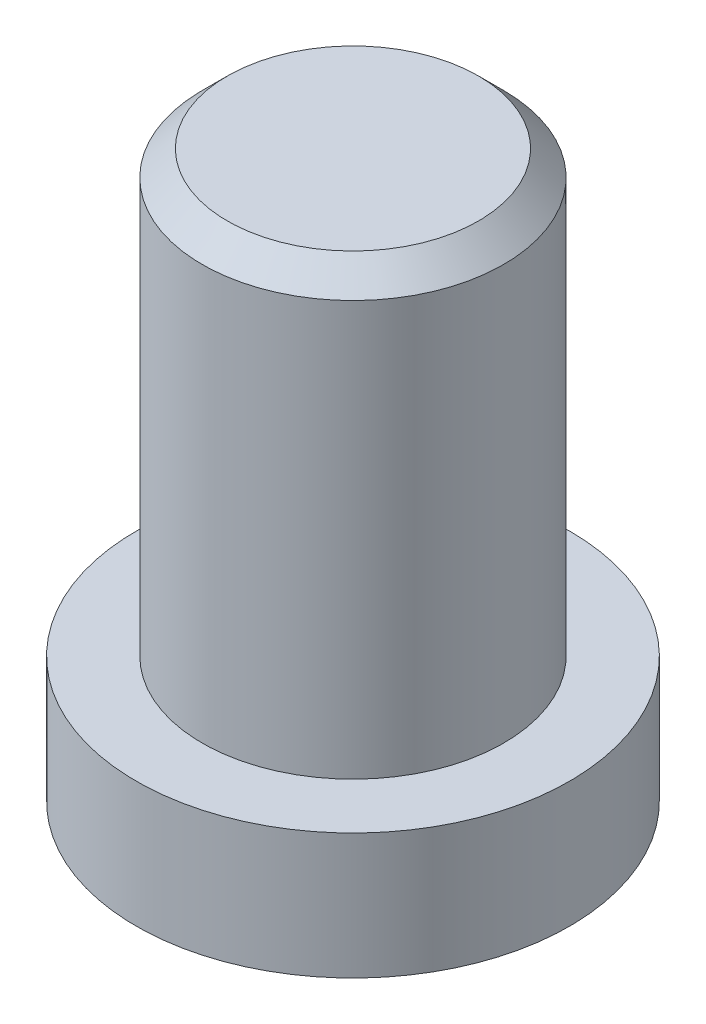
ISO-10303-21;
HEADER;
FILE_DESCRIPTION(('STEP AP214'),'2;1');
FILE_NAME('part.step','',(''),(''),'','','');
FILE_SCHEMA(('AUTOMOTIVE_DESIGN { 1 0 10303 214 1 1 1 1 }'));
ENDSEC;
DATA;
#1=APPLICATION_CONTEXT('core data for automotive mechanical design processes');
#2=APPLICATION_PROTOCOL_DEFINITION('international standard','automotive_design',2000,#1);
#3=PRODUCT_CONTEXT('',#1,'mechanical');
#4=PRODUCT('Part','Part','',(#3));
#5=PRODUCT_RELATED_PRODUCT_CATEGORY('part','',(#4));
#6=PRODUCT_DEFINITION_FORMATION('','',#4);
#7=PRODUCT_DEFINITION_CONTEXT('part definition',#1,'design');
#8=PRODUCT_DEFINITION('design','',#6,#7);
#9=PRODUCT_DEFINITION_SHAPE('','',#8);
#10=(LENGTH_UNIT() NAMED_UNIT(*) SI_UNIT(.MILLI.,.METRE.));
#11=(NAMED_UNIT(*) PLANE_ANGLE_UNIT() SI_UNIT($,.RADIAN.));
#12=(NAMED_UNIT(*) SI_UNIT($,.STERADIAN.) SOLID_ANGLE_UNIT());
#13=UNCERTAINTY_MEASURE_WITH_UNIT(LENGTH_MEASURE(1.E-05),#10,'distance_accuracy_value','');
#14=(GEOMETRIC_REPRESENTATION_CONTEXT(3) GLOBAL_UNCERTAINTY_ASSIGNED_CONTEXT((#13)) GLOBAL_UNIT_ASSIGNED_CONTEXT((#10,
#11,#12)) REPRESENTATION_CONTEXT('',''));
#15=CARTESIAN_POINT('',(0.,0.,0.));
#16=DIRECTION('',(0.,0.,1.));
#17=DIRECTION('',(1.,0.,0.));
#18=AXIS2_PLACEMENT_3D('',#15,#16,#17);
#19=CARTESIAN_POINT('',(0.,4.5,0.));
#20=DIRECTION('',(0.,-1.,0.));
#21=DIRECTION('',(0.,0.,-1.));
#22=AXIS2_PLACEMENT_3D('',#19,#20,#21);
#23=CYLINDRICAL_SURFACE('',#22,1.2);
#24=CARTESIAN_POINT('',(0.,4.3,0.));
#25=DIRECTION('',(0.,1.,0.));
#26=DIRECTION('',(0.,0.,1.));
#27=AXIS2_PLACEMENT_3D('',#24,#25,#26);
#28=CIRCLE('',#27,1.2);
#29=CARTESIAN_POINT('',(0.,4.3,-1.2));
#30=VERTEX_POINT('',#29);
#31=EDGE_CURVE('E10',#30,#30,#28,.F.);
#32=ORIENTED_EDGE('',*,*,#31,.T.);
#33=EDGE_LOOP('',(#32));
#34=FACE_BOUND('',#33,.T.);
#35=CARTESIAN_POINT('',(0.,1.,0.));
#36=DIRECTION('',(0.,-1.,0.));
#37=DIRECTION('',(0.,0.,-1.));
#38=AXIS2_PLACEMENT_3D('',#35,#36,#37);
#39=CIRCLE('',#38,1.2);
#40=CARTESIAN_POINT('',(0.,1.,-1.2));
#41=VERTEX_POINT('',#40);
#42=EDGE_CURVE('E49',#41,#41,#39,.T.);
#43=ORIENTED_EDGE('',*,*,#42,.F.);
#44=EDGE_LOOP('',(#43));
#45=FACE_BOUND('',#44,.T.);
#46=ADVANCED_FACE('F37',(#34,#45),#23,.T.);
#47=CARTESIAN_POINT('',(0.,4.5,0.));
#48=DIRECTION('',(0.,1.,0.));
#49=DIRECTION('',(0.,0.,1.));
#50=AXIS2_PLACEMENT_3D('',#47,#48,#49);
#51=PLANE('',#50);
#52=CARTESIAN_POINT('',(0.,4.5,0.));
#53=DIRECTION('',(0.,1.,0.));
#54=DIRECTION('',(0.,0.,1.));
#55=AXIS2_PLACEMENT_3D('',#52,#53,#54);
#56=CIRCLE('',#55,1.);
#57=CARTESIAN_POINT('',(0.,4.5,-1.));
#58=VERTEX_POINT('',#57);
#59=EDGE_CURVE('E45',#58,#58,#56,.T.);
#60=ORIENTED_EDGE('',*,*,#59,.T.);
#61=EDGE_LOOP('',(#60));
#62=FACE_BOUND('',#61,.T.);
#63=ADVANCED_FACE('F76',(#62),#51,.T.);
#64=CARTESIAN_POINT('',(0.,1.,0.));
#65=DIRECTION('',(0.,-1.,0.));
#66=DIRECTION('',(0.,0.,-1.));
#67=AXIS2_PLACEMENT_3D('',#64,#65,#66);
#68=CYLINDRICAL_SURFACE('',#67,1.725);
#69=CARTESIAN_POINT('',(0.,1.,0.));
#70=DIRECTION('',(0.,-1.,0.));
#71=DIRECTION('',(0.,0.,-1.));
#72=AXIS2_PLACEMENT_3D('',#69,#70,#71);
#73=CIRCLE('',#72,1.725);
#74=CARTESIAN_POINT('',(0.,1.,-1.725));
#75=VERTEX_POINT('',#74);
#76=EDGE_CURVE('E53',#75,#75,#73,.T.);
#77=ORIENTED_EDGE('',*,*,#76,.T.);
#78=EDGE_LOOP('',(#77));
#79=FACE_BOUND('',#78,.T.);
#80=CARTESIAN_POINT('',(0.,0.,0.));
#81=DIRECTION('',(0.,-1.,0.));
#82=DIRECTION('',(0.,0.,-1.));
#83=AXIS2_PLACEMENT_3D('',#80,#81,#82);
#84=CIRCLE('',#83,1.725);
#85=CARTESIAN_POINT('',(0.,0.,-1.725));
#86=VERTEX_POINT('',#85);
#87=EDGE_CURVE('E56',#86,#86,#84,.T.);
#88=ORIENTED_EDGE('',*,*,#87,.F.);
#89=EDGE_LOOP('',(#88));
#90=FACE_BOUND('',#89,.T.);
#91=ADVANCED_FACE('F62',(#79,#90),#68,.T.);
#92=CARTESIAN_POINT('',(0.,1.,0.));
#93=DIRECTION('',(0.,-1.,0.));
#94=DIRECTION('',(0.,0.,-1.));
#95=AXIS2_PLACEMENT_3D('',#92,#93,#94);
#96=PLANE('',#95);
#97=ORIENTED_EDGE('',*,*,#42,.T.);
#98=EDGE_LOOP('',(#97));
#99=FACE_BOUND('',#98,.T.);
#100=ORIENTED_EDGE('',*,*,#76,.F.);
#101=EDGE_LOOP('',(#100));
#102=FACE_BOUND('',#101,.T.);
#103=ADVANCED_FACE('F65',(#99,#102),#96,.F.);
#104=CARTESIAN_POINT('',(0.,0.,0.));
#105=DIRECTION('',(0.,1.,0.));
#106=DIRECTION('',(0.,0.,1.));
#107=AXIS2_PLACEMENT_3D('',#104,#105,#106);
#108=PLANE('',#107);
#109=ORIENTED_EDGE('',*,*,#87,.T.);
#110=EDGE_LOOP('',(#109));
#111=FACE_BOUND('',#110,.T.);
#112=ADVANCED_FACE('F67',(#111),#108,.F.);
#113=CARTESIAN_POINT('',(0.,4.5,0.));
#114=DIRECTION('',(0.,-1.,0.));
#115=DIRECTION('',(0.,0.,-1.));
#116=AXIS2_PLACEMENT_3D('',#113,#114,#115);
#117=CONICAL_SURFACE('',#116,1.,0.785398163397447);
#118=CARTESIAN_POINT('',(0.,4.3,-1.2));
#119=CARTESIAN_POINT('',(0.,4.30208333333333,-1.19791666666667));
#120=CARTESIAN_POINT('',(0.,4.30416666666667,-1.19583333333333));
#121=CARTESIAN_POINT('',(0.,4.30833333333333,-1.19166666666667));
#122=CARTESIAN_POINT('',(0.,4.31041666666667,-1.18958333333333));
#123=CARTESIAN_POINT('',(0.,4.31458333333333,-1.18541666666667));
#124=CARTESIAN_POINT('',(0.,4.31666666666667,-1.18333333333333));
#125=CARTESIAN_POINT('',(0.,4.32083333333333,-1.17916666666667));
#126=CARTESIAN_POINT('',(0.,4.32291666666667,-1.17708333333333));
#127=CARTESIAN_POINT('',(0.,4.32708333333333,-1.17291666666667));
#128=CARTESIAN_POINT('',(0.,4.32916666666667,-1.17083333333333));
#129=CARTESIAN_POINT('',(0.,4.33333333333333,-1.16666666666667));
#130=CARTESIAN_POINT('',(0.,4.33541666666667,-1.16458333333333));
#131=CARTESIAN_POINT('',(0.,4.33958333333333,-1.16041666666667));
#132=CARTESIAN_POINT('',(0.,4.34166666666667,-1.15833333333333));
#133=CARTESIAN_POINT('',(0.,4.34583333333333,-1.15416666666667));
#134=CARTESIAN_POINT('',(0.,4.34791666666667,-1.15208333333333));
#135=CARTESIAN_POINT('',(0.,4.35208333333333,-1.14791666666667));
#136=CARTESIAN_POINT('',(0.,4.35416666666667,-1.14583333333333));
#137=CARTESIAN_POINT('',(0.,4.35833333333333,-1.14166666666667));
#138=CARTESIAN_POINT('',(0.,4.36041666666667,-1.13958333333333));
#139=CARTESIAN_POINT('',(0.,4.36458333333333,-1.13541666666667));
#140=CARTESIAN_POINT('',(0.,4.36666666666667,-1.13333333333333));
#141=CARTESIAN_POINT('',(0.,4.37083333333333,-1.12916666666667));
#142=CARTESIAN_POINT('',(0.,4.37291666666667,-1.12708333333333));
#143=CARTESIAN_POINT('',(0.,4.37708333333333,-1.12291666666667));
#144=CARTESIAN_POINT('',(0.,4.37916666666667,-1.12083333333333));
#145=CARTESIAN_POINT('',(0.,4.38333333333333,-1.11666666666667));
#146=CARTESIAN_POINT('',(0.,4.38541666666667,-1.11458333333333));
#147=CARTESIAN_POINT('',(0.,4.38958333333333,-1.11041666666667));
#148=CARTESIAN_POINT('',(0.,4.39166666666667,-1.10833333333333));
#149=CARTESIAN_POINT('',(0.,4.39583333333333,-1.10416666666667));
#150=CARTESIAN_POINT('',(0.,4.39791666666667,-1.10208333333333));
#151=CARTESIAN_POINT('',(0.,4.40208333333333,-1.09791666666667));
#152=CARTESIAN_POINT('',(0.,4.40416666666667,-1.09583333333333));
#153=CARTESIAN_POINT('',(0.,4.40833333333333,-1.09166666666667));
#154=CARTESIAN_POINT('',(0.,4.41041666666667,-1.08958333333333));
#155=CARTESIAN_POINT('',(0.,4.41458333333333,-1.08541666666667));
#156=CARTESIAN_POINT('',(0.,4.41666666666667,-1.08333333333333));
#157=CARTESIAN_POINT('',(0.,4.42083333333333,-1.07916666666667));
#158=CARTESIAN_POINT('',(0.,4.42291666666667,-1.07708333333333));
#159=CARTESIAN_POINT('',(0.,4.42708333333333,-1.07291666666667));
#160=CARTESIAN_POINT('',(0.,4.42916666666667,-1.07083333333333));
#161=CARTESIAN_POINT('',(0.,4.43333333333333,-1.06666666666667));
#162=CARTESIAN_POINT('',(0.,4.43541666666667,-1.06458333333333));
#163=CARTESIAN_POINT('',(0.,4.43958333333333,-1.06041666666667));
#164=CARTESIAN_POINT('',(0.,4.44166666666667,-1.05833333333333));
#165=CARTESIAN_POINT('',(0.,4.44583333333333,-1.05416666666667));
#166=CARTESIAN_POINT('',(0.,4.44791666666667,-1.05208333333333));
#167=CARTESIAN_POINT('',(0.,4.45208333333333,-1.04791666666667));
#168=CARTESIAN_POINT('',(0.,4.45416666666667,-1.04583333333333));
#169=CARTESIAN_POINT('',(0.,4.45833333333333,-1.04166666666667));
#170=CARTESIAN_POINT('',(0.,4.46041666666667,-1.03958333333333));
#171=CARTESIAN_POINT('',(0.,4.46458333333333,-1.03541666666667));
#172=CARTESIAN_POINT('',(0.,4.46666666666667,-1.03333333333333));
#173=CARTESIAN_POINT('',(0.,4.47083333333333,-1.02916666666667));
#174=CARTESIAN_POINT('',(0.,4.47291666666667,-1.02708333333333));
#175=CARTESIAN_POINT('',(0.,4.47708333333333,-1.02291666666667));
#176=CARTESIAN_POINT('',(0.,4.47916666666667,-1.02083333333333));
#177=CARTESIAN_POINT('',(0.,4.48333333333333,-1.01666666666667));
#178=CARTESIAN_POINT('',(0.,4.48541666666667,-1.01458333333333));
#179=CARTESIAN_POINT('',(0.,4.48958333333333,-1.01041666666667));
#180=CARTESIAN_POINT('',(0.,4.49166666666667,-1.00833333333333));
#181=CARTESIAN_POINT('',(0.,4.49583333333333,-1.00416666666667));
#182=CARTESIAN_POINT('',(0.,4.49791666666667,-1.00208333333333));
#183=CARTESIAN_POINT('',(0.,4.5,-1.));
#184=B_SPLINE_CURVE_WITH_KNOTS('',3,(#118,#119,#120,#121,#122,#123,#124,#125,#126,#127,#128,
#129,#130,#131,#132,#133,#134,#135,#136,#137,#138,#139,#140,#141,#142,#143,#144,#145,#146,#147,
#148,#149,#150,#151,#152,#153,#154,#155,#156,#157,#158,#159,#160,#161,#162,#163,#164,#165,#166,
#167,#168,#169,#170,#171,#172,#173,#174,#175,#176,#177,#178,#179,#180,#181,#182,#183),
.UNSPECIFIED.,.F.,.F.,(4,2,2,2,2,2,2,2,2,2,2,2,2,2,2,2,2,2,2,2,2,2,2,2,2,2,2,2,2,2,2,2,4),(0.,
0.00883883476483194,0.0176776695296639,0.0265165042944958,0.0353553390593278,0.0441941738241591,
0.053033008588991,0.061871843353823,0.0707106781186549,0.0795495128834869,0.0883883476483182,
0.0972271824131501,0.106066017177982,0.114904851942814,0.123743686707645,0.132582521472477,
0.141421356237309,0.150260191002141,0.159099025766973,0.167937860531804,0.176776695296636,
0.185615530061468,0.1944543648263,0.203293199591132,0.212132034355964,0.220970869120796,
0.229809703885628,0.23864853865046,0.247487373415291,0.256326208180123,0.265165042944955,
0.274003877709787,0.282842712474619),.UNSPECIFIED.);
#185=EDGE_CURVE('BSEAM40',#30,#58,#184,.T.);
#186=ORIENTED_EDGE('',*,*,#31,.F.);
#187=ORIENTED_EDGE('',*,*,#59,.F.);
#188=ORIENTED_EDGE('',*,*,#185,.T.);
#189=ORIENTED_EDGE('',*,*,#185,.F.);
#190=EDGE_LOOP('',(#186,#188,#187,#189));
#191=FACE_BOUND('',#190,.T.);
#192=ADVANCED_FACE('F40',(#191),#117,.T.);
#193=CLOSED_SHELL('',(#46,#63,#91,#103,#112,#192));
#194=MANIFOLD_SOLID_BREP('B2',#193);
#195=ADVANCED_BREP_SHAPE_REPRESENTATION('',(#18,#194),#14);
#196=SHAPE_DEFINITION_REPRESENTATION(#9,#195);
ENDSEC;
END-ISO-10303-21;
